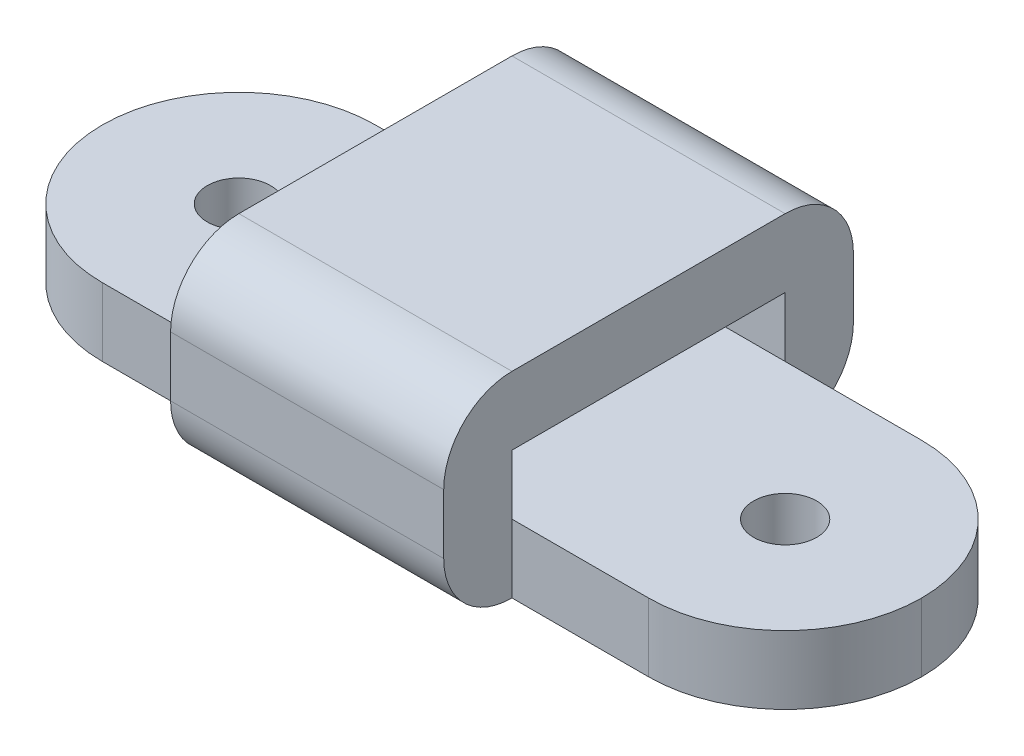
ISO-10303-21;
HEADER;
FILE_DESCRIPTION(('STEP AP214'),'2;1');
FILE_NAME('part.step','',(''),(''),'','','');
FILE_SCHEMA(('AUTOMOTIVE_DESIGN { 1 0 10303 214 1 1 1 1 }'));
ENDSEC;
DATA;
#1=APPLICATION_CONTEXT('core data for automotive mechanical design processes');
#2=APPLICATION_PROTOCOL_DEFINITION('international standard','automotive_design',2000,#1);
#3=PRODUCT_CONTEXT('',#1,'mechanical');
#4=PRODUCT('Part','Part','',(#3));
#5=PRODUCT_RELATED_PRODUCT_CATEGORY('part','',(#4));
#6=PRODUCT_DEFINITION_FORMATION('','',#4);
#7=PRODUCT_DEFINITION_CONTEXT('part definition',#1,'design');
#8=PRODUCT_DEFINITION('design','',#6,#7);
#9=PRODUCT_DEFINITION_SHAPE('','',#8);
#10=(LENGTH_UNIT() NAMED_UNIT(*) SI_UNIT(.MILLI.,.METRE.));
#11=(NAMED_UNIT(*) PLANE_ANGLE_UNIT() SI_UNIT($,.RADIAN.));
#12=(NAMED_UNIT(*) SI_UNIT($,.STERADIAN.) SOLID_ANGLE_UNIT());
#13=UNCERTAINTY_MEASURE_WITH_UNIT(LENGTH_MEASURE(1.E-05),#10,'distance_accuracy_value','');
#14=(GEOMETRIC_REPRESENTATION_CONTEXT(3) GLOBAL_UNCERTAINTY_ASSIGNED_CONTEXT((#13)) GLOBAL_UNIT_ASSIGNED_CONTEXT((#10,
#11,#12)) REPRESENTATION_CONTEXT('',''));
#15=CARTESIAN_POINT('',(0.,0.,0.));
#16=DIRECTION('',(0.,0.,1.));
#17=DIRECTION('',(1.,0.,0.));
#18=AXIS2_PLACEMENT_3D('',#15,#16,#17);
#19=CARTESIAN_POINT('',(-24.,4.,-8.));
#20=DIRECTION('',(0.,0.,1.));
#21=DIRECTION('',(1.,0.,0.));
#22=AXIS2_PLACEMENT_3D('',#19,#20,#21);
#23=PLANE('',#22);
#24=DIRECTION('',(-1.,0.,0.));
#25=VECTOR('',#24,1.);
#26=CARTESIAN_POINT('',(-24.,0.,-8.));
#27=LINE('',#26,#25);
#28=CARTESIAN_POINT('',(-8.,0.,-8.));
#29=VERTEX_POINT('',#28);
#30=CARTESIAN_POINT('',(-16.,0.,-8.));
#31=VERTEX_POINT('',#30);
#32=EDGE_CURVE('E224',#29,#31,#27,.T.);
#33=ORIENTED_EDGE('',*,*,#32,.T.);
#34=DIRECTION('',(0.,-1.,0.));
#35=VECTOR('',#34,1.);
#36=CARTESIAN_POINT('',(-16.,4.,-8.));
#37=LINE('',#36,#35);
#38=CARTESIAN_POINT('',(-16.,4.,-8.));
#39=VERTEX_POINT('',#38);
#40=EDGE_CURVE('E298',#31,#39,#37,.F.);
#41=ORIENTED_EDGE('',*,*,#40,.T.);
#42=DIRECTION('',(-1.,0.,0.));
#43=VECTOR('',#42,1.);
#44=CARTESIAN_POINT('',(-24.,4.,-8.));
#45=LINE('',#44,#43);
#46=CARTESIAN_POINT('',(-8.,4.,-8.));
#47=VERTEX_POINT('',#46);
#48=EDGE_CURVE('E231',#47,#39,#45,.T.);
#49=ORIENTED_EDGE('',*,*,#48,.F.);
#50=DIRECTION('',(0.,-1.,0.));
#51=VECTOR('',#50,1.);
#52=CARTESIAN_POINT('',(-8.,4.,-8.));
#53=LINE('',#52,#51);
#54=EDGE_CURVE('E209',#47,#29,#53,.T.);
#55=ORIENTED_EDGE('',*,*,#54,.T.);
#56=EDGE_LOOP('',(#33,#41,#49,#55));
#57=FACE_BOUND('',#56,.T.);
#58=ADVANCED_FACE('F33',(#57),#23,.F.);
#59=CARTESIAN_POINT('',(-24.,4.,8.));
#60=DIRECTION('',(0.,0.,-1.));
#61=DIRECTION('',(-1.,0.,0.));
#62=AXIS2_PLACEMENT_3D('',#59,#60,#61);
#63=PLANE('',#62);
#64=DIRECTION('',(1.,0.,0.));
#65=VECTOR('',#64,1.);
#66=CARTESIAN_POINT('',(-24.,4.,8.));
#67=LINE('',#66,#65);
#68=CARTESIAN_POINT('',(-16.,4.,8.));
#69=VERTEX_POINT('',#68);
#70=CARTESIAN_POINT('',(-8.,4.,8.));
#71=VERTEX_POINT('',#70);
#72=EDGE_CURVE('E232',#69,#71,#67,.T.);
#73=ORIENTED_EDGE('',*,*,#72,.F.);
#74=DIRECTION('',(0.,-1.,0.));
#75=VECTOR('',#74,1.);
#76=CARTESIAN_POINT('',(-16.,4.,8.));
#77=LINE('',#76,#75);
#78=CARTESIAN_POINT('',(-16.,0.,8.));
#79=VERTEX_POINT('',#78);
#80=EDGE_CURVE('E281',#69,#79,#77,.T.);
#81=ORIENTED_EDGE('',*,*,#80,.T.);
#82=DIRECTION('',(1.,0.,0.));
#83=VECTOR('',#82,1.);
#84=CARTESIAN_POINT('',(-24.,0.,8.));
#85=LINE('',#84,#83);
#86=CARTESIAN_POINT('',(-8.,0.,8.));
#87=VERTEX_POINT('',#86);
#88=EDGE_CURVE('E239',#79,#87,#85,.T.);
#89=ORIENTED_EDGE('',*,*,#88,.T.);
#90=DIRECTION('',(0.,-1.,0.));
#91=VECTOR('',#90,1.);
#92=CARTESIAN_POINT('',(-8.,4.,8.));
#93=LINE('',#92,#91);
#94=EDGE_CURVE('E234',#71,#87,#93,.T.);
#95=ORIENTED_EDGE('',*,*,#94,.F.);
#96=EDGE_LOOP('',(#73,#81,#89,#95));
#97=FACE_BOUND('',#96,.T.);
#98=ADVANCED_FACE('F336',(#97),#63,.F.);
#99=CARTESIAN_POINT('',(0.,4.,0.));
#100=DIRECTION('',(0.,-1.,0.));
#101=DIRECTION('',(0.,0.,-1.));
#102=AXIS2_PLACEMENT_3D('',#99,#100,#101);
#103=PLANE('',#102);
#104=CARTESIAN_POINT('',(-16.,4.,0.));
#105=DIRECTION('',(0.,1.,0.));
#106=DIRECTION('',(0.,0.,1.));
#107=AXIS2_PLACEMENT_3D('',#104,#105,#106);
#108=CIRCLE('',#107,1.85);
#109=CARTESIAN_POINT('',(-16.,4.,1.85));
#110=VERTEX_POINT('',#109);
#111=EDGE_CURVE('E221',#110,#110,#108,.T.);
#112=ORIENTED_EDGE('',*,*,#111,.F.);
#113=EDGE_LOOP('',(#112));
#114=FACE_BOUND('',#113,.T.);
#115=CARTESIAN_POINT('',(-16.,4.,0.));
#116=DIRECTION('',(0.,-1.,0.));
#117=DIRECTION('',(0.,0.,-1.));
#118=AXIS2_PLACEMENT_3D('',#115,#116,#117);
#119=CIRCLE('',#118,8.);
#120=CARTESIAN_POINT('',(-24.,4.,0.));
#121=VERTEX_POINT('',#120);
#122=EDGE_CURVE('E58',#39,#121,#119,.F.);
#123=ORIENTED_EDGE('',*,*,#122,.T.);
#124=CARTESIAN_POINT('',(-16.,4.,0.));
#125=DIRECTION('',(0.,-1.,0.));
#126=DIRECTION('',(0.,0.,-1.));
#127=AXIS2_PLACEMENT_3D('',#124,#125,#126);
#128=CIRCLE('',#127,8.);
#129=EDGE_CURVE('E296',#121,#69,#128,.F.);
#130=ORIENTED_EDGE('',*,*,#129,.T.);
#131=ORIENTED_EDGE('',*,*,#72,.T.);
#132=CARTESIAN_POINT('',(8.,4.,8.));
#133=VERTEX_POINT('',#132);
#134=EDGE_CURVE('E235',#71,#133,#67,.T.);
#135=ORIENTED_EDGE('',*,*,#134,.T.);
#136=CARTESIAN_POINT('',(16.,4.,8.));
#137=VERTEX_POINT('',#136);
#138=EDGE_CURVE('E229',#133,#137,#67,.T.);
#139=ORIENTED_EDGE('',*,*,#138,.T.);
#140=CARTESIAN_POINT('',(16.,4.,0.));
#141=DIRECTION('',(0.,-1.,0.));
#142=DIRECTION('',(0.,0.,-1.));
#143=AXIS2_PLACEMENT_3D('',#140,#141,#142);
#144=CIRCLE('',#143,8.);
#145=CARTESIAN_POINT('',(24.,4.,0.));
#146=VERTEX_POINT('',#145);
#147=EDGE_CURVE('E50',#137,#146,#144,.F.);
#148=ORIENTED_EDGE('',*,*,#147,.T.);
#149=CARTESIAN_POINT('',(16.,4.,0.));
#150=DIRECTION('',(0.,-1.,0.));
#151=DIRECTION('',(0.,0.,-1.));
#152=AXIS2_PLACEMENT_3D('',#149,#150,#151);
#153=CIRCLE('',#152,8.);
#154=CARTESIAN_POINT('',(16.,4.,-8.));
#155=VERTEX_POINT('',#154);
#156=EDGE_CURVE('E292',#146,#155,#153,.F.);
#157=ORIENTED_EDGE('',*,*,#156,.T.);
#158=CARTESIAN_POINT('',(8.,4.,-8.));
#159=VERTEX_POINT('',#158);
#160=EDGE_CURVE('E227',#155,#159,#45,.T.);
#161=ORIENTED_EDGE('',*,*,#160,.T.);
#162=EDGE_CURVE('E230',#159,#47,#45,.T.);
#163=ORIENTED_EDGE('',*,*,#162,.T.);
#164=ORIENTED_EDGE('',*,*,#48,.T.);
#165=EDGE_LOOP('',(#123,#130,#131,#135,#139,#148,#157,#161,#163,#164));
#166=FACE_BOUND('',#165,.T.);
#167=CARTESIAN_POINT('',(16.,4.,0.));
#168=DIRECTION('',(0.,1.,0.));
#169=DIRECTION('',(0.,0.,1.));
#170=AXIS2_PLACEMENT_3D('',#167,#168,#169);
#171=CIRCLE('',#170,1.85);
#172=CARTESIAN_POINT('',(16.,4.,1.85));
#173=VERTEX_POINT('',#172);
#174=EDGE_CURVE('E215',#173,#173,#171,.T.);
#175=ORIENTED_EDGE('',*,*,#174,.F.);
#176=EDGE_LOOP('',(#175));
#177=FACE_BOUND('',#176,.T.);
#178=ADVANCED_FACE('F311',(#114,#166,#177),#103,.F.);
#179=CARTESIAN_POINT('',(0.,0.,0.));
#180=DIRECTION('',(0.,-1.,0.));
#181=DIRECTION('',(0.,0.,-1.));
#182=AXIS2_PLACEMENT_3D('',#179,#180,#181);
#183=PLANE('',#182);
#184=CARTESIAN_POINT('',(-16.,0.,0.));
#185=DIRECTION('',(0.,1.,0.));
#186=DIRECTION('',(0.,0.,1.));
#187=AXIS2_PLACEMENT_3D('',#184,#185,#186);
#188=CIRCLE('',#187,1.85);
#189=CARTESIAN_POINT('',(-16.,0.,1.85));
#190=VERTEX_POINT('',#189);
#191=EDGE_CURVE('E218',#190,#190,#188,.T.);
#192=ORIENTED_EDGE('',*,*,#191,.T.);
#193=EDGE_LOOP('',(#192));
#194=FACE_BOUND('',#193,.T.);
#195=ORIENTED_EDGE('',*,*,#88,.F.);
#196=CARTESIAN_POINT('',(-16.,0.,0.));
#197=DIRECTION('',(0.,-1.,0.));
#198=DIRECTION('',(0.,0.,-1.));
#199=AXIS2_PLACEMENT_3D('',#196,#197,#198);
#200=CIRCLE('',#199,8.);
#201=CARTESIAN_POINT('',(-24.,0.,0.));
#202=VERTEX_POINT('',#201);
#203=EDGE_CURVE('E290',#79,#202,#200,.T.);
#204=ORIENTED_EDGE('',*,*,#203,.T.);
#205=CARTESIAN_POINT('',(-16.,0.,0.));
#206=DIRECTION('',(0.,-1.,0.));
#207=DIRECTION('',(0.,0.,-1.));
#208=AXIS2_PLACEMENT_3D('',#205,#206,#207);
#209=CIRCLE('',#208,8.);
#210=EDGE_CURVE('E288',#202,#31,#209,.T.);
#211=ORIENTED_EDGE('',*,*,#210,.T.);
#212=ORIENTED_EDGE('',*,*,#32,.F.);
#213=DIRECTION('',(-1.,0.,0.));
#214=VECTOR('',#213,1.);
#215=CARTESIAN_POINT('',(8.,0.,-8.));
#216=LINE('',#215,#214);
#217=CARTESIAN_POINT('',(8.,0.,-8.));
#218=VERTEX_POINT('',#217);
#219=EDGE_CURVE('E270',#29,#218,#216,.F.);
#220=ORIENTED_EDGE('',*,*,#219,.T.);
#221=CARTESIAN_POINT('',(16.,0.,-8.));
#222=VERTEX_POINT('',#221);
#223=EDGE_CURVE('E236',#222,#218,#27,.T.);
#224=ORIENTED_EDGE('',*,*,#223,.F.);
#225=CARTESIAN_POINT('',(16.,0.,0.));
#226=DIRECTION('',(0.,-1.,0.));
#227=DIRECTION('',(0.,0.,-1.));
#228=AXIS2_PLACEMENT_3D('',#225,#226,#227);
#229=CIRCLE('',#228,8.);
#230=CARTESIAN_POINT('',(24.,0.,0.));
#231=VERTEX_POINT('',#230);
#232=EDGE_CURVE('E284',#222,#231,#229,.T.);
#233=ORIENTED_EDGE('',*,*,#232,.T.);
#234=CARTESIAN_POINT('',(16.,0.,0.));
#235=DIRECTION('',(0.,-1.,0.));
#236=DIRECTION('',(0.,0.,-1.));
#237=AXIS2_PLACEMENT_3D('',#234,#235,#236);
#238=CIRCLE('',#237,8.);
#239=CARTESIAN_POINT('',(16.,0.,8.));
#240=VERTEX_POINT('',#239);
#241=EDGE_CURVE('E286',#231,#240,#238,.T.);
#242=ORIENTED_EDGE('',*,*,#241,.T.);
#243=CARTESIAN_POINT('',(8.,0.,8.));
#244=VERTEX_POINT('',#243);
#245=EDGE_CURVE('E238',#244,#240,#85,.T.);
#246=ORIENTED_EDGE('',*,*,#245,.F.);
#247=DIRECTION('',(-1.,0.,0.));
#248=VECTOR('',#247,1.);
#249=CARTESIAN_POINT('',(0.,0.,7.99999999999997));
#250=LINE('',#249,#248);
#251=EDGE_CURVE('E273',#244,#87,#250,.T.);
#252=ORIENTED_EDGE('',*,*,#251,.T.);
#253=EDGE_LOOP('',(#195,#204,#211,#212,#220,#224,#233,#242,#246,#252));
#254=FACE_BOUND('',#253,.T.);
#255=CARTESIAN_POINT('',(16.,0.,0.));
#256=DIRECTION('',(0.,1.,0.));
#257=DIRECTION('',(0.,0.,1.));
#258=AXIS2_PLACEMENT_3D('',#255,#256,#257);
#259=CIRCLE('',#258,1.85);
#260=CARTESIAN_POINT('',(16.,0.,1.85));
#261=VERTEX_POINT('',#260);
#262=EDGE_CURVE('E183',#261,#261,#259,.T.);
#263=ORIENTED_EDGE('',*,*,#262,.T.);
#264=EDGE_LOOP('',(#263));
#265=FACE_BOUND('',#264,.T.);
#266=ADVANCED_FACE('F346',(#194,#254,#265),#183,.T.);
#267=ORIENTED_EDGE('',*,*,#160,.F.);
#268=DIRECTION('',(0.,-1.,0.));
#269=VECTOR('',#268,1.);
#270=CARTESIAN_POINT('',(16.,4.,-8.));
#271=LINE('',#270,#269);
#272=EDGE_CURVE('E11',#155,#222,#271,.T.);
#273=ORIENTED_EDGE('',*,*,#272,.T.);
#274=ORIENTED_EDGE('',*,*,#223,.T.);
#275=DIRECTION('',(0.,-1.,0.));
#276=VECTOR('',#275,1.);
#277=CARTESIAN_POINT('',(8.,7.5,-8.));
#278=LINE('',#277,#276);
#279=EDGE_CURVE('E189',#159,#218,#278,.T.);
#280=ORIENTED_EDGE('',*,*,#279,.F.);
#281=EDGE_LOOP('',(#267,#273,#274,#280));
#282=FACE_BOUND('',#281,.T.);
#283=ADVANCED_FACE('F316',(#282),#23,.F.);
#284=ORIENTED_EDGE('',*,*,#245,.T.);
#285=DIRECTION('',(0.,-1.,0.));
#286=VECTOR('',#285,1.);
#287=CARTESIAN_POINT('',(16.,4.,8.));
#288=LINE('',#287,#286);
#289=EDGE_CURVE('E42',#240,#137,#288,.F.);
#290=ORIENTED_EDGE('',*,*,#289,.T.);
#291=ORIENTED_EDGE('',*,*,#138,.F.);
#292=DIRECTION('',(0.,-1.,0.));
#293=VECTOR('',#292,1.);
#294=CARTESIAN_POINT('',(8.,4.,8.));
#295=LINE('',#294,#293);
#296=EDGE_CURVE('E170',#133,#244,#295,.T.);
#297=ORIENTED_EDGE('',*,*,#296,.T.);
#298=EDGE_LOOP('',(#284,#290,#291,#297));
#299=FACE_BOUND('',#298,.T.);
#300=ADVANCED_FACE('F395',(#299),#63,.F.);
#301=CARTESIAN_POINT('',(-16.,4.,0.));
#302=DIRECTION('',(0.,-1.,0.));
#303=DIRECTION('',(0.,0.,-1.));
#304=AXIS2_PLACEMENT_3D('',#301,#302,#303);
#305=CYLINDRICAL_SURFACE('',#304,1.85);
#306=ORIENTED_EDGE('',*,*,#111,.T.);
#307=EDGE_LOOP('',(#306));
#308=FACE_BOUND('',#307,.T.);
#309=ORIENTED_EDGE('',*,*,#191,.F.);
#310=EDGE_LOOP('',(#309));
#311=FACE_BOUND('',#310,.T.);
#312=ADVANCED_FACE('F402',(#308,#311),#305,.F.);
#313=CARTESIAN_POINT('',(16.,4.,0.));
#314=DIRECTION('',(0.,-1.,0.));
#315=DIRECTION('',(0.,0.,-1.));
#316=AXIS2_PLACEMENT_3D('',#313,#314,#315);
#317=CYLINDRICAL_SURFACE('',#316,1.85);
#318=ORIENTED_EDGE('',*,*,#174,.T.);
#319=EDGE_LOOP('',(#318));
#320=FACE_BOUND('',#319,.T.);
#321=ORIENTED_EDGE('',*,*,#262,.F.);
#322=EDGE_LOOP('',(#321));
#323=FACE_BOUND('',#322,.T.);
#324=ADVANCED_FACE('F416',(#320,#323),#317,.F.);
#325=CARTESIAN_POINT('',(8.,7.5,7.99999999999995));
#326=DIRECTION('',(0.,0.,-1.));
#327=DIRECTION('',(0.,1.,0.));
#328=AXIS2_PLACEMENT_3D('',#325,#326,#327);
#329=PLANE('',#328);
#330=ORIENTED_EDGE('',*,*,#134,.F.);
#331=DIRECTION('',(0.,-1.,0.));
#332=VECTOR('',#331,1.);
#333=CARTESIAN_POINT('',(-8.,7.5,7.99999999999995));
#334=LINE('',#333,#332);
#335=CARTESIAN_POINT('',(-8.,7.5,7.99999999999995));
#336=VERTEX_POINT('',#335);
#337=EDGE_CURVE('E179',#336,#71,#334,.T.);
#338=ORIENTED_EDGE('',*,*,#337,.F.);
#339=DIRECTION('',(-1.,0.,0.));
#340=VECTOR('',#339,1.);
#341=CARTESIAN_POINT('',(8.,7.5,7.99999999999995));
#342=LINE('',#341,#340);
#343=CARTESIAN_POINT('',(8.,7.5,7.99999999999995));
#344=VERTEX_POINT('',#343);
#345=EDGE_CURVE('E176',#344,#336,#342,.T.);
#346=ORIENTED_EDGE('',*,*,#345,.F.);
#347=DIRECTION('',(0.,-1.,0.));
#348=VECTOR('',#347,1.);
#349=CARTESIAN_POINT('',(8.,4.,7.99999999999997));
#350=LINE('',#349,#348);
#351=EDGE_CURVE('E161',#344,#133,#350,.T.);
#352=ORIENTED_EDGE('',*,*,#351,.T.);
#353=EDGE_LOOP('',(#330,#338,#346,#352));
#354=FACE_BOUND('',#353,.T.);
#355=ADVANCED_FACE('F177',(#354),#329,.T.);
#356=CARTESIAN_POINT('',(8.,4.,-8.));
#357=DIRECTION('',(0.,0.,-1.));
#358=DIRECTION('',(-1.,0.,0.));
#359=AXIS2_PLACEMENT_3D('',#356,#357,#358);
#360=PLANE('',#359);
#361=CARTESIAN_POINT('',(-8.,7.5,-8.));
#362=VERTEX_POINT('',#361);
#363=EDGE_CURVE('E210',#362,#47,#53,.T.);
#364=ORIENTED_EDGE('',*,*,#363,.T.);
#365=ORIENTED_EDGE('',*,*,#162,.F.);
#366=CARTESIAN_POINT('',(8.,7.5,-8.));
#367=VERTEX_POINT('',#366);
#368=EDGE_CURVE('E192',#367,#159,#278,.T.);
#369=ORIENTED_EDGE('',*,*,#368,.F.);
#370=DIRECTION('',(-1.,0.,0.));
#371=VECTOR('',#370,1.);
#372=CARTESIAN_POINT('',(8.,7.5,-8.));
#373=LINE('',#372,#371);
#374=EDGE_CURVE('E184',#367,#362,#373,.T.);
#375=ORIENTED_EDGE('',*,*,#374,.T.);
#376=EDGE_LOOP('',(#364,#365,#369,#375));
#377=FACE_BOUND('',#376,.T.);
#378=ADVANCED_FACE('F321',(#377),#360,.F.);
#379=CARTESIAN_POINT('',(8.,0.,-12.));
#380=DIRECTION('',(0.,0.,1.));
#381=DIRECTION('',(1.,0.,0.));
#382=AXIS2_PLACEMENT_3D('',#379,#380,#381);
#383=PLANE('',#382);
#384=DIRECTION('',(0.,1.,0.));
#385=VECTOR('',#384,1.);
#386=CARTESIAN_POINT('',(8.,0.,-12.));
#387=LINE('',#386,#385);
#388=CARTESIAN_POINT('',(8.,4.,-12.));
#389=VERTEX_POINT('',#388);
#390=CARTESIAN_POINT('',(8.,7.5,-12.));
#391=VERTEX_POINT('',#390);
#392=EDGE_CURVE('E213',#389,#391,#387,.T.);
#393=ORIENTED_EDGE('',*,*,#392,.F.);
#394=DIRECTION('',(-1.,0.,0.));
#395=VECTOR('',#394,1.);
#396=CARTESIAN_POINT('',(-8.,4.,-12.));
#397=LINE('',#396,#395);
#398=CARTESIAN_POINT('',(-8.,4.,-12.));
#399=VERTEX_POINT('',#398);
#400=EDGE_CURVE('E278',#389,#399,#397,.T.);
#401=ORIENTED_EDGE('',*,*,#400,.T.);
#402=DIRECTION('',(0.,1.,0.));
#403=VECTOR('',#402,1.);
#404=CARTESIAN_POINT('',(-8.,0.,-12.));
#405=LINE('',#404,#403);
#406=CARTESIAN_POINT('',(-8.,7.5,-12.));
#407=VERTEX_POINT('',#406);
#408=EDGE_CURVE('E196',#399,#407,#405,.T.);
#409=ORIENTED_EDGE('',*,*,#408,.T.);
#410=DIRECTION('',(-1.,0.,0.));
#411=VECTOR('',#410,1.);
#412=CARTESIAN_POINT('',(8.,7.5,-12.));
#413=LINE('',#412,#411);
#414=EDGE_CURVE('E276',#407,#391,#413,.F.);
#415=ORIENTED_EDGE('',*,*,#414,.T.);
#416=EDGE_LOOP('',(#393,#401,#409,#415));
#417=FACE_BOUND('',#416,.T.);
#418=ADVANCED_FACE('F355',(#417),#383,.F.);
#419=CARTESIAN_POINT('',(8.,11.5,-12.));
#420=DIRECTION('',(0.,-1.,0.));
#421=DIRECTION('',(0.,0.,-1.));
#422=AXIS2_PLACEMENT_3D('',#419,#420,#421);
#423=PLANE('',#422);
#424=DIRECTION('',(0.,0.,1.));
#425=VECTOR('',#424,1.);
#426=CARTESIAN_POINT('',(-8.,11.5,-12.));
#427=LINE('',#426,#425);
#428=CARTESIAN_POINT('',(-8.,11.5,-8.));
#429=VERTEX_POINT('',#428);
#430=CARTESIAN_POINT('',(-8.,11.5,7.99999999999995));
#431=VERTEX_POINT('',#430);
#432=EDGE_CURVE('E199',#429,#431,#427,.T.);
#433=ORIENTED_EDGE('',*,*,#432,.T.);
#434=DIRECTION('',(-1.,0.,0.));
#435=VECTOR('',#434,1.);
#436=CARTESIAN_POINT('',(8.,11.5,7.99999999999995));
#437=LINE('',#436,#435);
#438=CARTESIAN_POINT('',(8.,11.5,7.99999999999995));
#439=VERTEX_POINT('',#438);
#440=EDGE_CURVE('E260',#431,#439,#437,.F.);
#441=ORIENTED_EDGE('',*,*,#440,.T.);
#442=DIRECTION('',(0.,0.,1.));
#443=VECTOR('',#442,1.);
#444=CARTESIAN_POINT('',(8.,11.5,-12.));
#445=LINE('',#444,#443);
#446=CARTESIAN_POINT('',(8.,11.5,-8.));
#447=VERTEX_POINT('',#446);
#448=EDGE_CURVE('E357',#447,#439,#445,.T.);
#449=ORIENTED_EDGE('',*,*,#448,.F.);
#450=DIRECTION('',(-1.,0.,0.));
#451=VECTOR('',#450,1.);
#452=CARTESIAN_POINT('',(8.,11.5,-8.));
#453=LINE('',#452,#451);
#454=EDGE_CURVE('E257',#447,#429,#453,.T.);
#455=ORIENTED_EDGE('',*,*,#454,.T.);
#456=EDGE_LOOP('',(#433,#441,#449,#455));
#457=FACE_BOUND('',#456,.T.);
#458=ADVANCED_FACE('F374',(#457),#423,.F.);
#459=CARTESIAN_POINT('',(8.,0.,12.));
#460=DIRECTION('',(0.,0.,1.));
#461=DIRECTION('',(0.,-1.,0.));
#462=AXIS2_PLACEMENT_3D('',#459,#460,#461);
#463=PLANE('',#462);
#464=DIRECTION('',(0.,1.,0.));
#465=VECTOR('',#464,1.);
#466=CARTESIAN_POINT('',(8.,0.,12.));
#467=LINE('',#466,#465);
#468=CARTESIAN_POINT('',(8.,4.00000000000003,12.));
#469=VERTEX_POINT('',#468);
#470=CARTESIAN_POINT('',(8.,7.50000000000003,11.9999999999999));
#471=VERTEX_POINT('',#470);
#472=EDGE_CURVE('E173',#469,#471,#467,.T.);
#473=ORIENTED_EDGE('',*,*,#472,.T.);
#474=DIRECTION('',(-1.,0.,0.));
#475=VECTOR('',#474,1.);
#476=CARTESIAN_POINT('',(-8.,7.50000000000003,11.9999999999999));
#477=LINE('',#476,#475);
#478=CARTESIAN_POINT('',(-8.,7.50000000000003,11.9999999999999));
#479=VERTEX_POINT('',#478);
#480=EDGE_CURVE('E246',#471,#479,#477,.T.);
#481=ORIENTED_EDGE('',*,*,#480,.T.);
#482=DIRECTION('',(0.,1.,0.));
#483=VECTOR('',#482,1.);
#484=CARTESIAN_POINT('',(-8.,0.,12.));
#485=LINE('',#484,#483);
#486=CARTESIAN_POINT('',(-8.,4.00000000000003,12.));
#487=VERTEX_POINT('',#486);
#488=EDGE_CURVE('E203',#487,#479,#485,.T.);
#489=ORIENTED_EDGE('',*,*,#488,.F.);
#490=DIRECTION('',(-1.,0.,0.));
#491=VECTOR('',#490,1.);
#492=CARTESIAN_POINT('',(8.,4.00000000000003,12.));
#493=LINE('',#492,#491);
#494=EDGE_CURVE('E244',#487,#469,#493,.F.);
#495=ORIENTED_EDGE('',*,*,#494,.T.);
#496=EDGE_LOOP('',(#473,#481,#489,#495));
#497=FACE_BOUND('',#496,.T.);
#498=ADVANCED_FACE('F364',(#497),#463,.T.);
#499=CARTESIAN_POINT('',(8.,7.5,7.99999999999995));
#500=DIRECTION('',(0.,1.,0.));
#501=DIRECTION('',(0.,0.,1.));
#502=AXIS2_PLACEMENT_3D('',#499,#500,#501);
#503=PLANE('',#502);
#504=DIRECTION('',(0.,0.,-1.));
#505=VECTOR('',#504,1.);
#506=CARTESIAN_POINT('',(-8.,7.5,7.99999999999995));
#507=LINE('',#506,#505);
#508=EDGE_CURVE('E207',#336,#362,#507,.T.);
#509=ORIENTED_EDGE('',*,*,#508,.T.);
#510=ORIENTED_EDGE('',*,*,#374,.F.);
#511=DIRECTION('',(0.,0.,-1.));
#512=VECTOR('',#511,1.);
#513=CARTESIAN_POINT('',(8.,7.5,7.99999999999995));
#514=LINE('',#513,#512);
#515=EDGE_CURVE('E167',#344,#367,#514,.T.);
#516=ORIENTED_EDGE('',*,*,#515,.F.);
#517=ORIENTED_EDGE('',*,*,#345,.T.);
#518=EDGE_LOOP('',(#509,#510,#516,#517));
#519=FACE_BOUND('',#518,.T.);
#520=ADVANCED_FACE('F186',(#519),#503,.F.);
#521=CARTESIAN_POINT('',(8.,0.,0.));
#522=DIRECTION('',(1.,0.,0.));
#523=DIRECTION('',(0.,0.,-1.));
#524=AXIS2_PLACEMENT_3D('',#521,#522,#523);
#525=PLANE('',#524);
#526=ORIENTED_EDGE('',*,*,#448,.T.);
#527=CARTESIAN_POINT('',(8.,7.5,7.99999999999995));
#528=DIRECTION('',(1.,0.,0.));
#529=DIRECTION('',(0.,0.,-1.));
#530=AXIS2_PLACEMENT_3D('',#527,#528,#529);
#531=CIRCLE('',#530,4.);
#532=EDGE_CURVE('E268',#439,#471,#531,.T.);
#533=ORIENTED_EDGE('',*,*,#532,.T.);
#534=ORIENTED_EDGE('',*,*,#472,.F.);
#535=CARTESIAN_POINT('',(8.,4.,7.99999999999997));
#536=DIRECTION('',(1.,0.,0.));
#537=DIRECTION('',(0.,0.,-1.));
#538=AXIS2_PLACEMENT_3D('',#535,#536,#537);
#539=CIRCLE('',#538,4.);
#540=EDGE_CURVE('E266',#469,#244,#539,.T.);
#541=ORIENTED_EDGE('',*,*,#540,.T.);
#542=ORIENTED_EDGE('',*,*,#296,.F.);
#543=ORIENTED_EDGE('',*,*,#351,.F.);
#544=ORIENTED_EDGE('',*,*,#515,.T.);
#545=ORIENTED_EDGE('',*,*,#368,.T.);
#546=ORIENTED_EDGE('',*,*,#279,.T.);
#547=CARTESIAN_POINT('',(8.,4.,-8.));
#548=DIRECTION('',(1.,0.,0.));
#549=DIRECTION('',(0.,0.,-1.));
#550=AXIS2_PLACEMENT_3D('',#547,#548,#549);
#551=CIRCLE('',#550,4.);
#552=EDGE_CURVE('E264',#218,#389,#551,.T.);
#553=ORIENTED_EDGE('',*,*,#552,.T.);
#554=ORIENTED_EDGE('',*,*,#392,.T.);
#555=CARTESIAN_POINT('',(8.,7.5,-8.));
#556=DIRECTION('',(1.,0.,0.));
#557=DIRECTION('',(0.,0.,-1.));
#558=AXIS2_PLACEMENT_3D('',#555,#556,#557);
#559=CIRCLE('',#558,4.);
#560=EDGE_CURVE('E262',#391,#447,#559,.T.);
#561=ORIENTED_EDGE('',*,*,#560,.T.);
#562=EDGE_LOOP('',(#526,#533,#534,#541,#542,#543,#544,#545,#546,#553,#554,#561));
#563=FACE_BOUND('',#562,.T.);
#564=ADVANCED_FACE('F164',(#563),#525,.T.);
#565=CARTESIAN_POINT('',(-8.,0.,0.));
#566=DIRECTION('',(1.,0.,0.));
#567=DIRECTION('',(0.,0.,-1.));
#568=AXIS2_PLACEMENT_3D('',#565,#566,#567);
#569=PLANE('',#568);
#570=ORIENTED_EDGE('',*,*,#488,.T.);
#571=CARTESIAN_POINT('',(-8.,7.5,7.99999999999995));
#572=DIRECTION('',(1.,0.,0.));
#573=DIRECTION('',(0.,0.,-1.));
#574=AXIS2_PLACEMENT_3D('',#571,#572,#573);
#575=CIRCLE('',#574,4.);
#576=EDGE_CURVE('E255',#479,#431,#575,.F.);
#577=ORIENTED_EDGE('',*,*,#576,.T.);
#578=ORIENTED_EDGE('',*,*,#432,.F.);
#579=CARTESIAN_POINT('',(-8.,7.5,-8.));
#580=DIRECTION('',(1.,0.,0.));
#581=DIRECTION('',(0.,0.,-1.));
#582=AXIS2_PLACEMENT_3D('',#579,#580,#581);
#583=CIRCLE('',#582,4.);
#584=EDGE_CURVE('E249',#429,#407,#583,.F.);
#585=ORIENTED_EDGE('',*,*,#584,.T.);
#586=ORIENTED_EDGE('',*,*,#408,.F.);
#587=CARTESIAN_POINT('',(-8.,4.,-8.));
#588=DIRECTION('',(1.,0.,0.));
#589=DIRECTION('',(0.,0.,-1.));
#590=AXIS2_PLACEMENT_3D('',#587,#588,#589);
#591=CIRCLE('',#590,4.);
#592=EDGE_CURVE('E251',#399,#29,#591,.F.);
#593=ORIENTED_EDGE('',*,*,#592,.T.);
#594=ORIENTED_EDGE('',*,*,#54,.F.);
#595=ORIENTED_EDGE('',*,*,#363,.F.);
#596=ORIENTED_EDGE('',*,*,#508,.F.);
#597=ORIENTED_EDGE('',*,*,#337,.T.);
#598=ORIENTED_EDGE('',*,*,#94,.T.);
#599=CARTESIAN_POINT('',(-8.,4.,7.99999999999997));
#600=DIRECTION('',(1.,0.,0.));
#601=DIRECTION('',(0.,0.,-1.));
#602=AXIS2_PLACEMENT_3D('',#599,#600,#601);
#603=CIRCLE('',#602,4.);
#604=EDGE_CURVE('E253',#87,#487,#603,.F.);
#605=ORIENTED_EDGE('',*,*,#604,.T.);
#606=EDGE_LOOP('',(#570,#577,#578,#585,#586,#593,#594,#595,#596,#597,#598,#605));
#607=FACE_BOUND('',#606,.T.);
#608=ADVANCED_FACE('F340',(#607),#569,.F.);
#609=CARTESIAN_POINT('',(8.,7.5,7.99999999999995));
#610=DIRECTION('',(1.,0.,0.));
#611=DIRECTION('',(0.,0.,-1.));
#612=AXIS2_PLACEMENT_3D('',#609,#610,#611);
#613=CYLINDRICAL_SURFACE('',#612,4.);
#614=ORIENTED_EDGE('',*,*,#532,.F.);
#615=ORIENTED_EDGE('',*,*,#440,.F.);
#616=ORIENTED_EDGE('',*,*,#576,.F.);
#617=ORIENTED_EDGE('',*,*,#480,.F.);
#618=EDGE_LOOP('',(#614,#615,#616,#617));
#619=FACE_BOUND('',#618,.T.);
#620=ADVANCED_FACE('F370',(#619),#613,.T.);
#621=CARTESIAN_POINT('',(0.,4.,7.99999999999997));
#622=DIRECTION('',(-1.,0.,0.));
#623=DIRECTION('',(0.,0.,1.));
#624=AXIS2_PLACEMENT_3D('',#621,#622,#623);
#625=CYLINDRICAL_SURFACE('',#624,4.);
#626=ORIENTED_EDGE('',*,*,#540,.F.);
#627=ORIENTED_EDGE('',*,*,#494,.F.);
#628=ORIENTED_EDGE('',*,*,#604,.F.);
#629=ORIENTED_EDGE('',*,*,#251,.F.);
#630=EDGE_LOOP('',(#626,#627,#628,#629));
#631=FACE_BOUND('',#630,.T.);
#632=ADVANCED_FACE('F386',(#631),#625,.T.);
#633=CARTESIAN_POINT('',(8.,4.,-8.));
#634=DIRECTION('',(1.,0.,0.));
#635=DIRECTION('',(0.,0.,-1.));
#636=AXIS2_PLACEMENT_3D('',#633,#634,#635);
#637=CYLINDRICAL_SURFACE('',#636,4.);
#638=ORIENTED_EDGE('',*,*,#552,.F.);
#639=ORIENTED_EDGE('',*,*,#219,.F.);
#640=ORIENTED_EDGE('',*,*,#592,.F.);
#641=ORIENTED_EDGE('',*,*,#400,.F.);
#642=EDGE_LOOP('',(#638,#639,#640,#641));
#643=FACE_BOUND('',#642,.T.);
#644=ADVANCED_FACE('F349',(#643),#637,.T.);
#645=CARTESIAN_POINT('',(8.,7.5,-8.));
#646=DIRECTION('',(-1.,0.,0.));
#647=DIRECTION('',(0.,0.,1.));
#648=AXIS2_PLACEMENT_3D('',#645,#646,#647);
#649=CYLINDRICAL_SURFACE('',#648,4.);
#650=ORIENTED_EDGE('',*,*,#560,.F.);
#651=ORIENTED_EDGE('',*,*,#414,.F.);
#652=ORIENTED_EDGE('',*,*,#584,.F.);
#653=ORIENTED_EDGE('',*,*,#454,.F.);
#654=EDGE_LOOP('',(#650,#651,#652,#653));
#655=FACE_BOUND('',#654,.T.);
#656=ADVANCED_FACE('F378',(#655),#649,.T.);
#657=CARTESIAN_POINT('',(-16.,4.,0.));
#658=DIRECTION('',(0.,-1.,0.));
#659=DIRECTION('',(0.,0.,-1.));
#660=AXIS2_PLACEMENT_3D('',#657,#658,#659);
#661=CYLINDRICAL_SURFACE('',#660,8.);
#662=DIRECTION('',(0.,-1.,0.));
#663=VECTOR('',#662,1.);
#664=CARTESIAN_POINT('',(-24.,4.,0.));
#665=LINE('',#664,#663);
#666=EDGE_CURVE('E200',#121,#202,#665,.T.);
#667=ORIENTED_EDGE('',*,*,#666,.F.);
#668=ORIENTED_EDGE('',*,*,#122,.F.);
#669=ORIENTED_EDGE('',*,*,#40,.F.);
#670=ORIENTED_EDGE('',*,*,#210,.F.);
#671=EDGE_LOOP('',(#667,#668,#669,#670));
#672=FACE_BOUND('',#671,.T.);
#673=ADVANCED_FACE('F328',(#672),#661,.T.);
#674=CARTESIAN_POINT('',(-16.,4.,0.));
#675=DIRECTION('',(0.,-1.,0.));
#676=DIRECTION('',(0.,0.,-1.));
#677=AXIS2_PLACEMENT_3D('',#674,#675,#676);
#678=CYLINDRICAL_SURFACE('',#677,8.);
#679=ORIENTED_EDGE('',*,*,#129,.F.);
#680=ORIENTED_EDGE('',*,*,#666,.T.);
#681=ORIENTED_EDGE('',*,*,#203,.F.);
#682=ORIENTED_EDGE('',*,*,#80,.F.);
#683=EDGE_LOOP('',(#679,#680,#681,#682));
#684=FACE_BOUND('',#683,.T.);
#685=ADVANCED_FACE('F331',(#684),#678,.T.);
#686=CARTESIAN_POINT('',(16.,4.,0.));
#687=DIRECTION('',(0.,-1.,0.));
#688=DIRECTION('',(0.,0.,-1.));
#689=AXIS2_PLACEMENT_3D('',#686,#687,#688);
#690=CYLINDRICAL_SURFACE('',#689,8.);
#691=ORIENTED_EDGE('',*,*,#272,.F.);
#692=ORIENTED_EDGE('',*,*,#156,.F.);
#693=DIRECTION('',(0.,-1.,0.));
#694=VECTOR('',#693,1.);
#695=CARTESIAN_POINT('',(24.,4.,0.));
#696=LINE('',#695,#694);
#697=EDGE_CURVE('E37',#231,#146,#696,.F.);
#698=ORIENTED_EDGE('',*,*,#697,.F.);
#699=ORIENTED_EDGE('',*,*,#232,.F.);
#700=EDGE_LOOP('',(#691,#692,#698,#699));
#701=FACE_BOUND('',#700,.T.);
#702=ADVANCED_FACE('F35',(#701),#690,.T.);
#703=CARTESIAN_POINT('',(16.,4.,0.));
#704=DIRECTION('',(0.,-1.,0.));
#705=DIRECTION('',(0.,0.,-1.));
#706=AXIS2_PLACEMENT_3D('',#703,#704,#705);
#707=CYLINDRICAL_SURFACE('',#706,8.);
#708=ORIENTED_EDGE('',*,*,#147,.F.);
#709=ORIENTED_EDGE('',*,*,#289,.F.);
#710=ORIENTED_EDGE('',*,*,#241,.F.);
#711=ORIENTED_EDGE('',*,*,#697,.T.);
#712=EDGE_LOOP('',(#708,#709,#710,#711));
#713=FACE_BOUND('',#712,.T.);
#714=ADVANCED_FACE('F305',(#713),#707,.T.);
#715=CLOSED_SHELL('',(#58,#98,#178,#266,#283,#300,#312,#324,#355,#378,#418,#458,#498,#520,#564,
#608,#620,#632,#644,#656,#673,#685,#702,#714));
#716=MANIFOLD_SOLID_BREP('B2',#715);
#717=ADVANCED_BREP_SHAPE_REPRESENTATION('',(#18,#716),#14);
#718=SHAPE_DEFINITION_REPRESENTATION(#9,#717);
ENDSEC;
END-ISO-10303-21;
